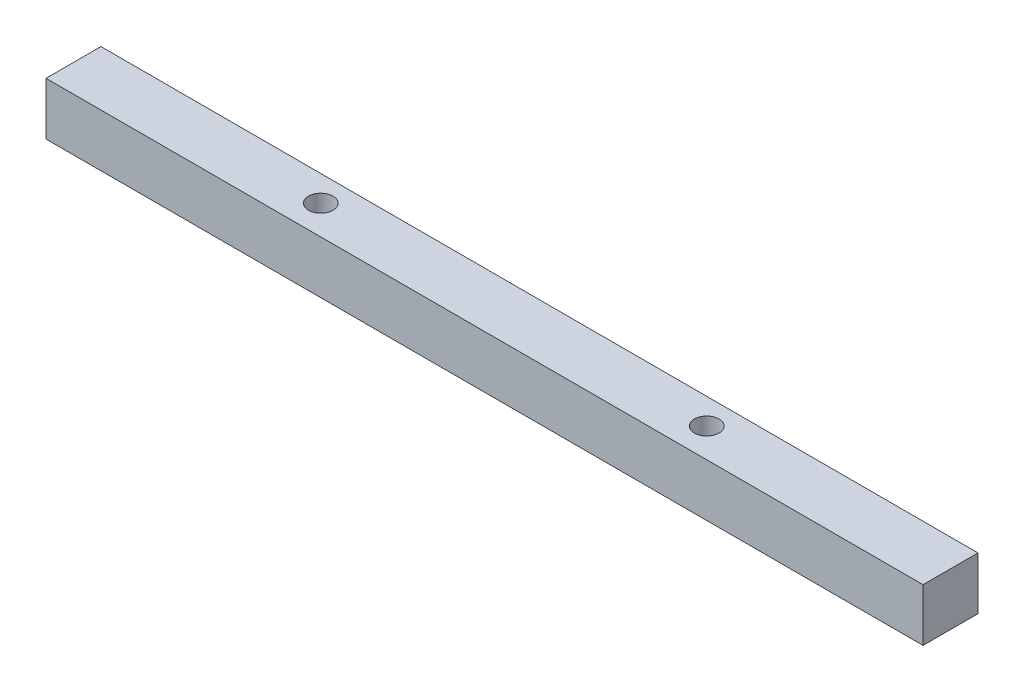
ISO-10303-21;
HEADER;
FILE_DESCRIPTION(('STEP AP214'),'2;1');
FILE_NAME('part.step','',(''),(''),'','','');
FILE_SCHEMA(('AUTOMOTIVE_DESIGN { 1 0 10303 214 1 1 1 1 }'));
ENDSEC;
DATA;
#1=APPLICATION_CONTEXT('core data for automotive mechanical design processes');
#2=APPLICATION_PROTOCOL_DEFINITION('international standard','automotive_design',2000,#1);
#3=PRODUCT_CONTEXT('',#1,'mechanical');
#4=PRODUCT('Part','Part','',(#3));
#5=PRODUCT_RELATED_PRODUCT_CATEGORY('part','',(#4));
#6=PRODUCT_DEFINITION_FORMATION('','',#4);
#7=PRODUCT_DEFINITION_CONTEXT('part definition',#1,'design');
#8=PRODUCT_DEFINITION('design','',#6,#7);
#9=PRODUCT_DEFINITION_SHAPE('','',#8);
#10=(LENGTH_UNIT() NAMED_UNIT(*) SI_UNIT(.MILLI.,.METRE.));
#11=(NAMED_UNIT(*) PLANE_ANGLE_UNIT() SI_UNIT($,.RADIAN.));
#12=(NAMED_UNIT(*) SI_UNIT($,.STERADIAN.) SOLID_ANGLE_UNIT());
#13=UNCERTAINTY_MEASURE_WITH_UNIT(LENGTH_MEASURE(1.E-05),#10,'distance_accuracy_value','');
#14=(GEOMETRIC_REPRESENTATION_CONTEXT(3) GLOBAL_UNCERTAINTY_ASSIGNED_CONTEXT((#13)) GLOBAL_UNIT_ASSIGNED_CONTEXT((#10,
#11,#12)) REPRESENTATION_CONTEXT('',''));
#15=CARTESIAN_POINT('',(0.,0.,0.));
#16=DIRECTION('',(0.,0.,1.));
#17=DIRECTION('',(1.,0.,0.));
#18=AXIS2_PLACEMENT_3D('',#15,#16,#17);
#19=CARTESIAN_POINT('',(150.,0.,0.));
#20=DIRECTION('',(0.,1.,0.));
#21=DIRECTION('',(0.,0.,1.));
#22=AXIS2_PLACEMENT_3D('',#19,#20,#21);
#23=PLANE('',#22);
#24=DIRECTION('',(0.,0.,-1.));
#25=VECTOR('',#24,1.);
#26=CARTESIAN_POINT('',(0.,0.,0.));
#27=LINE('',#26,#25);
#28=CARTESIAN_POINT('',(0.,0.,0.));
#29=VERTEX_POINT('',#28);
#30=CARTESIAN_POINT('',(0.,0.,-9.4));
#31=VERTEX_POINT('',#30);
#32=EDGE_CURVE('E104',#29,#31,#27,.T.);
#33=ORIENTED_EDGE('',*,*,#32,.T.);
#34=DIRECTION('',(-1.,0.,0.));
#35=VECTOR('',#34,1.);
#36=CARTESIAN_POINT('',(150.,0.,-9.4));
#37=LINE('',#36,#35);
#38=CARTESIAN_POINT('',(150.,0.,-9.4));
#39=VERTEX_POINT('',#38);
#40=EDGE_CURVE('E55',#39,#31,#37,.T.);
#41=ORIENTED_EDGE('',*,*,#40,.F.);
#42=DIRECTION('',(0.,0.,-1.));
#43=VECTOR('',#42,1.);
#44=CARTESIAN_POINT('',(150.,0.,0.));
#45=LINE('',#44,#43);
#46=CARTESIAN_POINT('',(150.,0.,0.));
#47=VERTEX_POINT('',#46);
#48=EDGE_CURVE('E94',#47,#39,#45,.T.);
#49=ORIENTED_EDGE('',*,*,#48,.F.);
#50=DIRECTION('',(-1.,0.,0.));
#51=VECTOR('',#50,1.);
#52=CARTESIAN_POINT('',(150.,0.,0.));
#53=LINE('',#52,#51);
#54=EDGE_CURVE('E11',#47,#29,#53,.T.);
#55=ORIENTED_EDGE('',*,*,#54,.T.);
#56=EDGE_LOOP('',(#33,#41,#49,#55));
#57=FACE_BOUND('',#56,.T.);
#58=CARTESIAN_POINT('',(42.,0.,-4.99850746268659));
#59=DIRECTION('',(0.,1.,0.));
#60=DIRECTION('',(0.,0.,1.));
#61=AXIS2_PLACEMENT_3D('',#58,#59,#60);
#62=CIRCLE('',#61,2.1);
#63=CARTESIAN_POINT('',(42.,0.,-2.89850746268658));
#64=VERTEX_POINT('',#63);
#65=EDGE_CURVE('E139',#64,#64,#62,.F.);
#66=ORIENTED_EDGE('',*,*,#65,.F.);
#67=EDGE_LOOP('',(#66));
#68=FACE_BOUND('',#67,.T.);
#69=CARTESIAN_POINT('',(108.,0.,-4.99850746268659));
#70=DIRECTION('',(0.,1.,0.));
#71=DIRECTION('',(0.,0.,1.));
#72=AXIS2_PLACEMENT_3D('',#69,#70,#71);
#73=CIRCLE('',#72,2.1);
#74=CARTESIAN_POINT('',(108.,0.,-2.89850746268658));
#75=VERTEX_POINT('',#74);
#76=EDGE_CURVE('E132',#75,#75,#73,.T.);
#77=ORIENTED_EDGE('',*,*,#76,.T.);
#78=EDGE_LOOP('',(#77));
#79=FACE_BOUND('',#78,.T.);
#80=ADVANCED_FACE('F44',(#57,#68,#79),#23,.F.);
#81=CARTESIAN_POINT('',(150.,9.,0.));
#82=DIRECTION('',(0.,-1.,0.));
#83=DIRECTION('',(0.,0.,-1.));
#84=AXIS2_PLACEMENT_3D('',#81,#82,#83);
#85=PLANE('',#84);
#86=DIRECTION('',(0.,0.,1.));
#87=VECTOR('',#86,1.);
#88=CARTESIAN_POINT('',(0.,9.,0.));
#89=LINE('',#88,#87);
#90=CARTESIAN_POINT('',(0.,9.,-9.4));
#91=VERTEX_POINT('',#90);
#92=CARTESIAN_POINT('',(0.,9.,0.));
#93=VERTEX_POINT('',#92);
#94=EDGE_CURVE('E87',#91,#93,#89,.T.);
#95=ORIENTED_EDGE('',*,*,#94,.T.);
#96=DIRECTION('',(-1.,0.,0.));
#97=VECTOR('',#96,1.);
#98=CARTESIAN_POINT('',(150.,9.,0.));
#99=LINE('',#98,#97);
#100=CARTESIAN_POINT('',(150.,9.,0.));
#101=VERTEX_POINT('',#100);
#102=EDGE_CURVE('E112',#101,#93,#99,.T.);
#103=ORIENTED_EDGE('',*,*,#102,.F.);
#104=DIRECTION('',(0.,0.,1.));
#105=VECTOR('',#104,1.);
#106=CARTESIAN_POINT('',(150.,9.,0.));
#107=LINE('',#106,#105);
#108=CARTESIAN_POINT('',(150.,9.,-9.4));
#109=VERTEX_POINT('',#108);
#110=EDGE_CURVE('E64',#109,#101,#107,.T.);
#111=ORIENTED_EDGE('',*,*,#110,.F.);
#112=DIRECTION('',(-1.,0.,0.));
#113=VECTOR('',#112,1.);
#114=CARTESIAN_POINT('',(150.,9.,-9.4));
#115=LINE('',#114,#113);
#116=EDGE_CURVE('E106',#109,#91,#115,.T.);
#117=ORIENTED_EDGE('',*,*,#116,.T.);
#118=EDGE_LOOP('',(#95,#103,#111,#117));
#119=FACE_BOUND('',#118,.T.);
#120=CARTESIAN_POINT('',(42.,9.,-4.99850746268659));
#121=DIRECTION('',(0.,-1.,0.));
#122=DIRECTION('',(0.,0.,-1.));
#123=AXIS2_PLACEMENT_3D('',#120,#121,#122);
#124=CIRCLE('',#123,2.1);
#125=CARTESIAN_POINT('',(42.,9.,-7.09850746268659));
#126=VERTEX_POINT('',#125);
#127=EDGE_CURVE('E129',#126,#126,#124,.F.);
#128=ORIENTED_EDGE('',*,*,#127,.F.);
#129=EDGE_LOOP('',(#128));
#130=FACE_BOUND('',#129,.T.);
#131=CARTESIAN_POINT('',(108.,9.,-4.99850746268659));
#132=DIRECTION('',(0.,-1.,0.));
#133=DIRECTION('',(0.,0.,-1.));
#134=AXIS2_PLACEMENT_3D('',#131,#132,#133);
#135=CIRCLE('',#134,2.1);
#136=CARTESIAN_POINT('',(108.,9.,-7.09850746268659));
#137=VERTEX_POINT('',#136);
#138=EDGE_CURVE('E48',#137,#137,#135,.T.);
#139=ORIENTED_EDGE('',*,*,#138,.T.);
#140=EDGE_LOOP('',(#139));
#141=FACE_BOUND('',#140,.T.);
#142=ADVANCED_FACE('F151',(#119,#130,#141),#85,.F.);
#143=CARTESIAN_POINT('',(150.,0.,0.));
#144=DIRECTION('',(0.,0.,-1.));
#145=DIRECTION('',(-1.,0.,0.));
#146=AXIS2_PLACEMENT_3D('',#143,#144,#145);
#147=PLANE('',#146);
#148=DIRECTION('',(0.,-1.,0.));
#149=VECTOR('',#148,1.);
#150=CARTESIAN_POINT('',(0.,0.,0.));
#151=LINE('',#150,#149);
#152=EDGE_CURVE('E116',#93,#29,#151,.T.);
#153=ORIENTED_EDGE('',*,*,#152,.T.);
#154=ORIENTED_EDGE('',*,*,#54,.F.);
#155=DIRECTION('',(0.,-1.,0.));
#156=VECTOR('',#155,1.);
#157=CARTESIAN_POINT('',(150.,0.,0.));
#158=LINE('',#157,#156);
#159=EDGE_CURVE('E99',#101,#47,#158,.T.);
#160=ORIENTED_EDGE('',*,*,#159,.F.);
#161=ORIENTED_EDGE('',*,*,#102,.T.);
#162=EDGE_LOOP('',(#153,#154,#160,#161));
#163=FACE_BOUND('',#162,.T.);
#164=ADVANCED_FACE('F46',(#163),#147,.F.);
#165=CARTESIAN_POINT('',(150.,0.,-9.4));
#166=DIRECTION('',(0.,0.,1.));
#167=DIRECTION('',(1.,0.,0.));
#168=AXIS2_PLACEMENT_3D('',#165,#166,#167);
#169=PLANE('',#168);
#170=DIRECTION('',(0.,1.,0.));
#171=VECTOR('',#170,1.);
#172=CARTESIAN_POINT('',(0.,0.,-9.4));
#173=LINE('',#172,#171);
#174=EDGE_CURVE('E81',#31,#91,#173,.T.);
#175=ORIENTED_EDGE('',*,*,#174,.T.);
#176=ORIENTED_EDGE('',*,*,#116,.F.);
#177=DIRECTION('',(0.,1.,0.));
#178=VECTOR('',#177,1.);
#179=CARTESIAN_POINT('',(150.,0.,-9.4));
#180=LINE('',#179,#178);
#181=EDGE_CURVE('E97',#39,#109,#180,.T.);
#182=ORIENTED_EDGE('',*,*,#181,.F.);
#183=ORIENTED_EDGE('',*,*,#40,.T.);
#184=EDGE_LOOP('',(#175,#176,#182,#183));
#185=FACE_BOUND('',#184,.T.);
#186=ADVANCED_FACE('F108',(#185),#169,.F.);
#187=CARTESIAN_POINT('',(150.,0.,0.));
#188=DIRECTION('',(-1.,0.,0.));
#189=DIRECTION('',(0.,0.,1.));
#190=AXIS2_PLACEMENT_3D('',#187,#188,#189);
#191=PLANE('',#190);
#192=ORIENTED_EDGE('',*,*,#159,.T.);
#193=ORIENTED_EDGE('',*,*,#48,.T.);
#194=ORIENTED_EDGE('',*,*,#181,.T.);
#195=ORIENTED_EDGE('',*,*,#110,.T.);
#196=EDGE_LOOP('',(#192,#193,#194,#195));
#197=FACE_BOUND('',#196,.T.);
#198=ADVANCED_FACE('F95',(#197),#191,.F.);
#199=CARTESIAN_POINT('',(0.,0.,0.));
#200=DIRECTION('',(-1.,0.,0.));
#201=DIRECTION('',(0.,0.,1.));
#202=AXIS2_PLACEMENT_3D('',#199,#200,#201);
#203=PLANE('',#202);
#204=ORIENTED_EDGE('',*,*,#152,.F.);
#205=ORIENTED_EDGE('',*,*,#94,.F.);
#206=ORIENTED_EDGE('',*,*,#174,.F.);
#207=ORIENTED_EDGE('',*,*,#32,.F.);
#208=EDGE_LOOP('',(#204,#205,#206,#207));
#209=FACE_BOUND('',#208,.T.);
#210=ADVANCED_FACE('F160',(#209),#203,.T.);
#211=CARTESIAN_POINT('',(42.,0.,-4.99850746268659));
#212=DIRECTION('',(0.,1.,0.));
#213=DIRECTION('',(0.,0.,1.));
#214=AXIS2_PLACEMENT_3D('',#211,#212,#213);
#215=CYLINDRICAL_SURFACE('',#214,2.1);
#216=ORIENTED_EDGE('',*,*,#65,.T.);
#217=EDGE_LOOP('',(#216));
#218=FACE_BOUND('',#217,.T.);
#219=ORIENTED_EDGE('',*,*,#127,.T.);
#220=EDGE_LOOP('',(#219));
#221=FACE_BOUND('',#220,.T.);
#222=ADVANCED_FACE('F149',(#218,#221),#215,.F.);
#223=CARTESIAN_POINT('',(108.,0.,-4.99850746268659));
#224=DIRECTION('',(0.,1.,0.));
#225=DIRECTION('',(0.,0.,1.));
#226=AXIS2_PLACEMENT_3D('',#223,#224,#225);
#227=CYLINDRICAL_SURFACE('',#226,2.1);
#228=ORIENTED_EDGE('',*,*,#76,.F.);
#229=EDGE_LOOP('',(#228));
#230=FACE_BOUND('',#229,.T.);
#231=ORIENTED_EDGE('',*,*,#138,.F.);
#232=EDGE_LOOP('',(#231));
#233=FACE_BOUND('',#232,.T.);
#234=ADVANCED_FACE('F168',(#230,#233),#227,.F.);
#235=CLOSED_SHELL('',(#80,#142,#164,#186,#198,#210,#222,#234));
#236=MANIFOLD_SOLID_BREP('B2',#235);
#237=ADVANCED_BREP_SHAPE_REPRESENTATION('',(#18,#236),#14);
#238=SHAPE_DEFINITION_REPRESENTATION(#9,#237);
ENDSEC;
END-ISO-10303-21;
